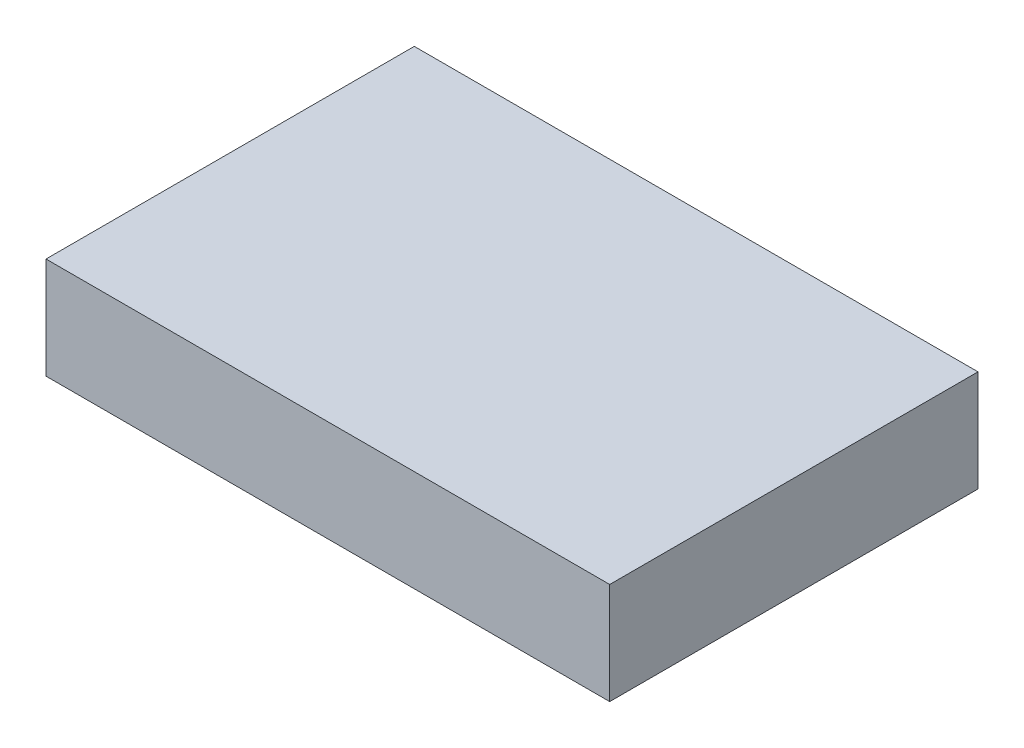
ISO-10303-21;
HEADER;
FILE_DESCRIPTION(('STEP AP214'),'2;1');
FILE_NAME('part.step','',(''),(''),'','','');
FILE_SCHEMA(('AUTOMOTIVE_DESIGN { 1 0 10303 214 1 1 1 1 }'));
ENDSEC;
DATA;
#1=APPLICATION_CONTEXT('core data for automotive mechanical design processes');
#2=APPLICATION_PROTOCOL_DEFINITION('international standard','automotive_design',2000,#1);
#3=PRODUCT_CONTEXT('',#1,'mechanical');
#4=PRODUCT('Part','Part','',(#3));
#5=PRODUCT_RELATED_PRODUCT_CATEGORY('part','',(#4));
#6=PRODUCT_DEFINITION_FORMATION('','',#4);
#7=PRODUCT_DEFINITION_CONTEXT('part definition',#1,'design');
#8=PRODUCT_DEFINITION('design','',#6,#7);
#9=PRODUCT_DEFINITION_SHAPE('','',#8);
#10=(LENGTH_UNIT() NAMED_UNIT(*) SI_UNIT(.MILLI.,.METRE.));
#11=(NAMED_UNIT(*) PLANE_ANGLE_UNIT() SI_UNIT($,.RADIAN.));
#12=(NAMED_UNIT(*) SI_UNIT($,.STERADIAN.) SOLID_ANGLE_UNIT());
#13=UNCERTAINTY_MEASURE_WITH_UNIT(LENGTH_MEASURE(1.E-05),#10,'distance_accuracy_value','');
#14=(GEOMETRIC_REPRESENTATION_CONTEXT(3) GLOBAL_UNCERTAINTY_ASSIGNED_CONTEXT((#13)) GLOBAL_UNIT_ASSIGNED_CONTEXT((#10,
#11,#12)) REPRESENTATION_CONTEXT('',''));
#15=CARTESIAN_POINT('',(0.,0.,0.));
#16=DIRECTION('',(0.,0.,1.));
#17=DIRECTION('',(1.,0.,0.));
#18=AXIS2_PLACEMENT_3D('',#15,#16,#17);
#19=CARTESIAN_POINT('',(4.48935,3.2456,1.104925));
#20=DIRECTION('',(0.,1.,0.));
#21=DIRECTION('',(1.,0.,0.));
#22=AXIS2_PLACEMENT_3D('',#19,#20,#21);
#23=PLANE('',#22);
#24=DIRECTION('',(-1.,0.,0.));
#25=VECTOR('',#24,1.);
#26=CARTESIAN_POINT('',(4.48935,3.2456,0.614924999999952));
#27=LINE('',#26,#25);
#28=CARTESIAN_POINT('',(5.23935,3.2456,0.614924999999952));
#29=VERTEX_POINT('',#28);
#30=CARTESIAN_POINT('',(3.73935,3.2456,0.614924999999952));
#31=VERTEX_POINT('',#30);
#32=EDGE_CURVE('E11',#29,#31,#27,.T.);
#33=ORIENTED_EDGE('',*,*,#32,.T.);
#34=DIRECTION('',(0.,0.,1.));
#35=VECTOR('',#34,1.);
#36=CARTESIAN_POINT('',(3.73935,3.2456,1.104925));
#37=LINE('',#36,#35);
#38=CARTESIAN_POINT('',(3.73935,3.2456,1.594925));
#39=VERTEX_POINT('',#38);
#40=EDGE_CURVE('E24',#31,#39,#37,.T.);
#41=ORIENTED_EDGE('',*,*,#40,.T.);
#42=DIRECTION('',(1.,0.,0.));
#43=VECTOR('',#42,1.);
#44=CARTESIAN_POINT('',(4.48935,3.2456,1.594925));
#45=LINE('',#44,#43);
#46=CARTESIAN_POINT('',(5.23935,3.2456,1.594925));
#47=VERTEX_POINT('',#46);
#48=EDGE_CURVE('E88',#39,#47,#45,.T.);
#49=ORIENTED_EDGE('',*,*,#48,.T.);
#50=DIRECTION('',(0.,0.,-1.));
#51=VECTOR('',#50,1.);
#52=CARTESIAN_POINT('',(5.23935,3.2456,1.104925));
#53=LINE('',#52,#51);
#54=EDGE_CURVE('E69',#47,#29,#53,.T.);
#55=ORIENTED_EDGE('',*,*,#54,.T.);
#56=EDGE_LOOP('',(#33,#41,#49,#55));
#57=FACE_BOUND('',#56,.T.);
#58=ADVANCED_FACE('F17',(#57),#23,.T.);
#59=CARTESIAN_POINT('',(3.73935,2.9756,1.104925));
#60=DIRECTION('',(-1.,0.,0.));
#61=DIRECTION('',(0.,1.,0.));
#62=AXIS2_PLACEMENT_3D('',#59,#60,#61);
#63=PLANE('',#62);
#64=DIRECTION('',(0.,0.,1.));
#65=VECTOR('',#64,1.);
#66=CARTESIAN_POINT('',(3.73935,2.9756,1.104925));
#67=LINE('',#66,#65);
#68=CARTESIAN_POINT('',(3.73935,2.9756,0.614924999999952));
#69=VERTEX_POINT('',#68);
#70=CARTESIAN_POINT('',(3.73935,2.9756,1.594925));
#71=VERTEX_POINT('',#70);
#72=EDGE_CURVE('E85',#69,#71,#67,.T.);
#73=ORIENTED_EDGE('',*,*,#72,.T.);
#74=DIRECTION('',(0.,1.,0.));
#75=VECTOR('',#74,1.);
#76=CARTESIAN_POINT('',(3.73935,2.9756,1.594925));
#77=LINE('',#76,#75);
#78=EDGE_CURVE('E76',#71,#39,#77,.T.);
#79=ORIENTED_EDGE('',*,*,#78,.T.);
#80=ORIENTED_EDGE('',*,*,#40,.F.);
#81=DIRECTION('',(0.,-1.,0.));
#82=VECTOR('',#81,1.);
#83=CARTESIAN_POINT('',(3.73935,2.9756,0.614924999999952));
#84=LINE('',#83,#82);
#85=EDGE_CURVE('E81',#31,#69,#84,.T.);
#86=ORIENTED_EDGE('',*,*,#85,.T.);
#87=EDGE_LOOP('',(#73,#79,#80,#86));
#88=FACE_BOUND('',#87,.T.);
#89=ADVANCED_FACE('F90',(#88),#63,.T.);
#90=CARTESIAN_POINT('',(4.48935,2.9756,0.614924999999952));
#91=DIRECTION('',(0.,0.,-1.));
#92=DIRECTION('',(0.,1.,0.));
#93=AXIS2_PLACEMENT_3D('',#90,#91,#92);
#94=PLANE('',#93);
#95=DIRECTION('',(-1.,0.,0.));
#96=VECTOR('',#95,1.);
#97=CARTESIAN_POINT('',(4.48935,2.9756,0.614924999999952));
#98=LINE('',#97,#96);
#99=CARTESIAN_POINT('',(5.23935,2.9756,0.614924999999952));
#100=VERTEX_POINT('',#99);
#101=EDGE_CURVE('E60',#100,#69,#98,.T.);
#102=ORIENTED_EDGE('',*,*,#101,.T.);
#103=ORIENTED_EDGE('',*,*,#85,.F.);
#104=ORIENTED_EDGE('',*,*,#32,.F.);
#105=DIRECTION('',(0.,-1.,0.));
#106=VECTOR('',#105,1.);
#107=CARTESIAN_POINT('',(5.23935,2.9756,0.614924999999952));
#108=LINE('',#107,#106);
#109=EDGE_CURVE('E63',#29,#100,#108,.T.);
#110=ORIENTED_EDGE('',*,*,#109,.T.);
#111=EDGE_LOOP('',(#102,#103,#104,#110));
#112=FACE_BOUND('',#111,.T.);
#113=ADVANCED_FACE('F91',(#112),#94,.T.);
#114=CARTESIAN_POINT('',(5.23935,2.9756,1.104925));
#115=DIRECTION('',(1.,0.,0.));
#116=DIRECTION('',(0.,-1.,0.));
#117=AXIS2_PLACEMENT_3D('',#114,#115,#116);
#118=PLANE('',#117);
#119=DIRECTION('',(0.,0.,-1.));
#120=VECTOR('',#119,1.);
#121=CARTESIAN_POINT('',(5.23935,2.9756,1.104925));
#122=LINE('',#121,#120);
#123=CARTESIAN_POINT('',(5.23935,2.9756,1.594925));
#124=VERTEX_POINT('',#123);
#125=EDGE_CURVE('E54',#124,#100,#122,.T.);
#126=ORIENTED_EDGE('',*,*,#125,.T.);
#127=ORIENTED_EDGE('',*,*,#109,.F.);
#128=ORIENTED_EDGE('',*,*,#54,.F.);
#129=DIRECTION('',(0.,-1.,0.));
#130=VECTOR('',#129,1.);
#131=CARTESIAN_POINT('',(5.23935,2.9756,1.594925));
#132=LINE('',#131,#130);
#133=EDGE_CURVE('E64',#47,#124,#132,.T.);
#134=ORIENTED_EDGE('',*,*,#133,.T.);
#135=EDGE_LOOP('',(#126,#127,#128,#134));
#136=FACE_BOUND('',#135,.T.);
#137=ADVANCED_FACE('F68',(#136),#118,.T.);
#138=CARTESIAN_POINT('',(4.48935,2.9756,1.594925));
#139=DIRECTION('',(0.,0.,1.));
#140=DIRECTION('',(0.,-1.,0.));
#141=AXIS2_PLACEMENT_3D('',#138,#139,#140);
#142=PLANE('',#141);
#143=DIRECTION('',(1.,0.,0.));
#144=VECTOR('',#143,1.);
#145=CARTESIAN_POINT('',(4.48935,2.9756,1.594925));
#146=LINE('',#145,#144);
#147=EDGE_CURVE('E58',#71,#124,#146,.T.);
#148=ORIENTED_EDGE('',*,*,#147,.T.);
#149=ORIENTED_EDGE('',*,*,#133,.F.);
#150=ORIENTED_EDGE('',*,*,#48,.F.);
#151=ORIENTED_EDGE('',*,*,#78,.F.);
#152=EDGE_LOOP('',(#148,#149,#150,#151));
#153=FACE_BOUND('',#152,.T.);
#154=ADVANCED_FACE('F74',(#153),#142,.T.);
#155=CARTESIAN_POINT('',(4.48935,2.9756,1.104925));
#156=DIRECTION('',(0.,1.,0.));
#157=DIRECTION('',(1.,0.,0.));
#158=AXIS2_PLACEMENT_3D('',#155,#156,#157);
#159=PLANE('',#158);
#160=ORIENTED_EDGE('',*,*,#147,.F.);
#161=ORIENTED_EDGE('',*,*,#72,.F.);
#162=ORIENTED_EDGE('',*,*,#101,.F.);
#163=ORIENTED_EDGE('',*,*,#125,.F.);
#164=EDGE_LOOP('',(#160,#161,#162,#163));
#165=FACE_BOUND('',#164,.T.);
#166=ADVANCED_FACE('F56',(#165),#159,.F.);
#167=CLOSED_SHELL('',(#58,#89,#113,#137,#154,#166));
#168=MANIFOLD_SOLID_BREP('B1',#167);
#169=ADVANCED_BREP_SHAPE_REPRESENTATION('',(#18,#168),#14);
#170=SHAPE_DEFINITION_REPRESENTATION(#9,#169);
ENDSEC;
END-ISO-10303-21;
